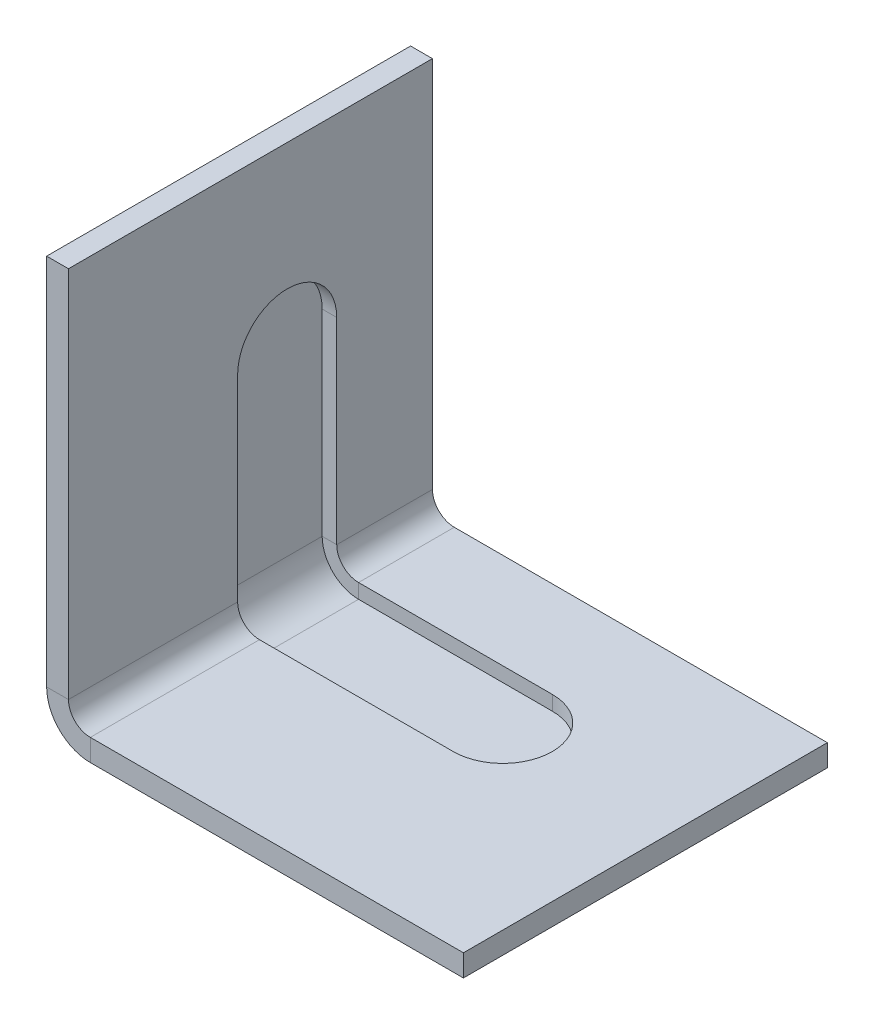
ISO-10303-21;
HEADER;
FILE_DESCRIPTION(('STEP AP214'),'2;1');
FILE_NAME('part.step','',(''),(''),'','','');
FILE_SCHEMA(('AUTOMOTIVE_DESIGN { 1 0 10303 214 1 1 1 1 }'));
ENDSEC;
DATA;
#1=APPLICATION_CONTEXT('core data for automotive mechanical design processes');
#2=APPLICATION_PROTOCOL_DEFINITION('international standard','automotive_design',2000,#1);
#3=PRODUCT_CONTEXT('',#1,'mechanical');
#4=PRODUCT('Part','Part','',(#3));
#5=PRODUCT_RELATED_PRODUCT_CATEGORY('part','',(#4));
#6=PRODUCT_DEFINITION_FORMATION('','',#4);
#7=PRODUCT_DEFINITION_CONTEXT('part definition',#1,'design');
#8=PRODUCT_DEFINITION('design','',#6,#7);
#9=PRODUCT_DEFINITION_SHAPE('','',#8);
#10=(LENGTH_UNIT() NAMED_UNIT(*) SI_UNIT(.MILLI.,.METRE.));
#11=(NAMED_UNIT(*) PLANE_ANGLE_UNIT() SI_UNIT($,.RADIAN.));
#12=(NAMED_UNIT(*) SI_UNIT($,.STERADIAN.) SOLID_ANGLE_UNIT());
#13=UNCERTAINTY_MEASURE_WITH_UNIT(LENGTH_MEASURE(1.E-05),#10,'distance_accuracy_value','');
#14=(GEOMETRIC_REPRESENTATION_CONTEXT(3) GLOBAL_UNCERTAINTY_ASSIGNED_CONTEXT((#13)) GLOBAL_UNIT_ASSIGNED_CONTEXT((#10,
#11,#12)) REPRESENTATION_CONTEXT('',''));
#15=CARTESIAN_POINT('',(0.,0.,0.));
#16=DIRECTION('',(0.,0.,1.));
#17=DIRECTION('',(1.,0.,0.));
#18=AXIS2_PLACEMENT_3D('',#15,#16,#17);
#19=CARTESIAN_POINT('',(-9.8014285714286,30.2073806679078,26.7582020038617));
#20=DIRECTION('',(0.,0.,1.));
#21=DIRECTION('',(0.,-1.,0.));
#22=AXIS2_PLACEMENT_3D('',#19,#20,#21);
#23=PLANE('',#22);
#24=DIRECTION('',(0.,-1.,0.));
#25=VECTOR('',#24,1.);
#26=CARTESIAN_POINT('',(-7.8014285714286,30.2073806679078,26.7582020038617));
#27=LINE('',#26,#25);
#28=CARTESIAN_POINT('',(-7.8014285714286,30.2073806679078,26.7582020038617));
#29=VERTEX_POINT('',#28);
#30=CARTESIAN_POINT('',(-7.8014285714286,3.17143459243136,26.7582020038617));
#31=VERTEX_POINT('',#30);
#32=EDGE_CURVE('E363',#29,#31,#27,.T.);
#33=ORIENTED_EDGE('',*,*,#32,.T.);
#34=CARTESIAN_POINT('',(-7.8014285714286,3.17143459243144,26.7582020038617));
#35=CARTESIAN_POINT('',(-9.80142857142861,3.17143459243138,26.7582020038617));
#36=B_SPLINE_CURVE_WITH_KNOTS('',1,(#34,#35),.UNSPECIFIED.,.F.,.F.,(2,2),(0.,1.),.UNSPECIFIED.);
#37=CARTESIAN_POINT('',(-9.8014285714286,3.17143459243136,26.7582020038617));
#38=VERTEX_POINT('',#37);
#39=EDGE_CURVE('E401',#31,#38,#36,.T.);
#40=ORIENTED_EDGE('',*,*,#39,.T.);
#41=DIRECTION('',(0.,-1.,0.));
#42=VECTOR('',#41,1.);
#43=CARTESIAN_POINT('',(-9.8014285714286,30.2073806679078,26.7582020038617));
#44=LINE('',#43,#42);
#45=CARTESIAN_POINT('',(-9.8014285714286,30.2073806679078,26.7582020038617));
#46=VERTEX_POINT('',#45);
#47=EDGE_CURVE('E359',#46,#38,#44,.T.);
#48=ORIENTED_EDGE('',*,*,#47,.F.);
#49=DIRECTION('',(1.,0.,0.));
#50=VECTOR('',#49,1.);
#51=CARTESIAN_POINT('',(-9.8014285714286,30.2073806679078,26.7582020038617));
#52=LINE('',#51,#50);
#53=EDGE_CURVE('E367',#46,#29,#52,.T.);
#54=ORIENTED_EDGE('',*,*,#53,.T.);
#55=EDGE_LOOP('',(#33,#40,#48,#54));
#56=FACE_BOUND('',#55,.T.);
#57=ADVANCED_FACE('F125',(#56),#23,.F.);
#58=CARTESIAN_POINT('',(-7.8014285714286,54.4285714285714,50.));
#59=DIRECTION('',(1.,0.,0.));
#60=DIRECTION('',(0.,0.,-1.));
#61=AXIS2_PLACEMENT_3D('',#58,#59,#60);
#62=PLANE('',#61);
#63=CARTESIAN_POINT('',(-7.8014285714286,30.2073806679078,19.9530054101729));
#64=DIRECTION('',(1.,0.,0.));
#65=DIRECTION('',(0.,1.,0.));
#66=AXIS2_PLACEMENT_3D('',#63,#64,#65);
#67=CIRCLE('',#66,6.80519659368883);
#68=CARTESIAN_POINT('',(-7.8014285714286,30.2073806679078,13.147808816484));
#69=VERTEX_POINT('',#68);
#70=EDGE_CURVE('E345',#69,#29,#67,.T.);
#71=ORIENTED_EDGE('',*,*,#70,.F.);
#72=DIRECTION('',(0.,-1.,0.));
#73=VECTOR('',#72,1.);
#74=CARTESIAN_POINT('',(-7.8014285714286,30.2073806679078,13.147808816484));
#75=LINE('',#74,#73);
#76=CARTESIAN_POINT('',(-7.8014285714286,3.17143459243141,13.147808816484));
#77=VERTEX_POINT('',#76);
#78=EDGE_CURVE('E360',#69,#77,#75,.T.);
#79=ORIENTED_EDGE('',*,*,#78,.T.);
#80=DIRECTION('',(0.,0.,-1.));
#81=VECTOR('',#80,1.);
#82=CARTESIAN_POINT('',(-7.8014285714286,3.17143459243136,50.));
#83=LINE('',#82,#81);
#84=CARTESIAN_POINT('',(-7.80142857142856,3.17143459243141,0.));
#85=VERTEX_POINT('',#84);
#86=EDGE_CURVE('E370',#77,#85,#83,.T.);
#87=ORIENTED_EDGE('',*,*,#86,.T.);
#88=DIRECTION('',(0.,-1.,0.));
#89=VECTOR('',#88,1.);
#90=CARTESIAN_POINT('',(-7.8014285714286,54.4285714285714,0.));
#91=LINE('',#90,#89);
#92=CARTESIAN_POINT('',(-7.8014285714286,54.4285714285714,0.));
#93=VERTEX_POINT('',#92);
#94=EDGE_CURVE('E374',#93,#85,#91,.T.);
#95=ORIENTED_EDGE('',*,*,#94,.F.);
#96=DIRECTION('',(0.,0.,-1.));
#97=VECTOR('',#96,1.);
#98=CARTESIAN_POINT('',(-7.8014285714286,54.4285714285714,50.));
#99=LINE('',#98,#97);
#100=CARTESIAN_POINT('',(-7.8014285714286,54.4285714285714,50.));
#101=VERTEX_POINT('',#100);
#102=EDGE_CURVE('E381',#101,#93,#99,.T.);
#103=ORIENTED_EDGE('',*,*,#102,.F.);
#104=DIRECTION('',(0.,-1.,0.));
#105=VECTOR('',#104,1.);
#106=CARTESIAN_POINT('',(-7.8014285714286,54.4285714285714,50.));
#107=LINE('',#106,#105);
#108=CARTESIAN_POINT('',(-7.80142857142861,3.17143459243141,50.));
#109=VERTEX_POINT('',#108);
#110=EDGE_CURVE('E379',#101,#109,#107,.T.);
#111=ORIENTED_EDGE('',*,*,#110,.T.);
#112=DIRECTION('',(0.,0.,-1.));
#113=VECTOR('',#112,1.);
#114=CARTESIAN_POINT('',(-7.8014285714286,3.17143459243136,50.));
#115=LINE('',#114,#113);
#116=EDGE_CURVE('E409',#109,#31,#115,.T.);
#117=ORIENTED_EDGE('',*,*,#116,.T.);
#118=ORIENTED_EDGE('',*,*,#32,.F.);
#119=EDGE_LOOP('',(#71,#79,#87,#95,#103,#111,#117,#118));
#120=FACE_BOUND('',#119,.T.);
#121=ADVANCED_FACE('F445',(#120),#62,.T.);
#122=CARTESIAN_POINT('',(-10.8014285714286,54.4285714285714,50.));
#123=DIRECTION('',(0.,1.,0.));
#124=DIRECTION('',(0.,0.,1.));
#125=AXIS2_PLACEMENT_3D('',#122,#123,#124);
#126=PLANE('',#125);
#127=DIRECTION('',(1.,0.,0.));
#128=VECTOR('',#127,1.);
#129=CARTESIAN_POINT('',(-10.8014285714286,54.4285714285714,0.));
#130=LINE('',#129,#128);
#131=CARTESIAN_POINT('',(-10.8014285714286,54.4285714285714,0.));
#132=VERTEX_POINT('',#131);
#133=EDGE_CURVE('E376',#132,#93,#130,.T.);
#134=ORIENTED_EDGE('',*,*,#133,.F.);
#135=DIRECTION('',(0.,0.,-1.));
#136=VECTOR('',#135,1.);
#137=CARTESIAN_POINT('',(-10.8014285714286,54.4285714285714,50.));
#138=LINE('',#137,#136);
#139=CARTESIAN_POINT('',(-10.8014285714286,54.4285714285714,50.));
#140=VERTEX_POINT('',#139);
#141=EDGE_CURVE('E372',#140,#132,#138,.T.);
#142=ORIENTED_EDGE('',*,*,#141,.F.);
#143=DIRECTION('',(1.,0.,0.));
#144=VECTOR('',#143,1.);
#145=CARTESIAN_POINT('',(-10.8014285714286,54.4285714285714,50.));
#146=LINE('',#145,#144);
#147=EDGE_CURVE('E366',#140,#101,#146,.T.);
#148=ORIENTED_EDGE('',*,*,#147,.T.);
#149=ORIENTED_EDGE('',*,*,#102,.T.);
#150=EDGE_LOOP('',(#134,#142,#148,#149));
#151=FACE_BOUND('',#150,.T.);
#152=ADVANCED_FACE('F487',(#151),#126,.T.);
#153=CARTESIAN_POINT('',(0.,0.,0.));
#154=DIRECTION('',(0.,0.,1.));
#155=DIRECTION('',(1.,0.,0.));
#156=AXIS2_PLACEMENT_3D('',#153,#154,#155);
#157=PLANE('',#156);
#158=DIRECTION('',(1.,0.,0.));
#159=VECTOR('',#158,1.);
#160=CARTESIAN_POINT('',(0.,3.17143459243136,0.));
#161=LINE('',#160,#159);
#162=CARTESIAN_POINT('',(-10.8014285714286,3.17143459243141,0.));
#163=VERTEX_POINT('',#162);
#164=EDGE_CURVE('E13',#163,#85,#161,.T.);
#165=ORIENTED_EDGE('',*,*,#164,.F.);
#166=DIRECTION('',(0.,1.,0.));
#167=VECTOR('',#166,1.);
#168=CARTESIAN_POINT('',(-10.8014285714286,54.4285714285714,0.));
#169=LINE('',#168,#167);
#170=EDGE_CURVE('E141',#132,#163,#169,.F.);
#171=ORIENTED_EDGE('',*,*,#170,.F.);
#172=ORIENTED_EDGE('',*,*,#133,.T.);
#173=ORIENTED_EDGE('',*,*,#94,.T.);
#174=EDGE_LOOP('',(#165,#171,#172,#173));
#175=FACE_BOUND('',#174,.T.);
#176=ADVANCED_FACE('F450',(#175),#157,.F.);
#177=CARTESIAN_POINT('',(-10.8014285714286,54.4285714285714,50.));
#178=DIRECTION('',(1.,0.,0.));
#179=DIRECTION('',(0.,0.,-1.));
#180=AXIS2_PLACEMENT_3D('',#177,#178,#179);
#181=PLANE('',#180);
#182=DIRECTION('',(0.,0.,-1.));
#183=VECTOR('',#182,1.);
#184=CARTESIAN_POINT('',(-10.8014285714286,3.17143459243136,50.));
#185=LINE('',#184,#183);
#186=CARTESIAN_POINT('',(-10.8014285714286,3.17143459243141,50.));
#187=VERTEX_POINT('',#186);
#188=EDGE_CURVE('E133',#187,#163,#185,.T.);
#189=ORIENTED_EDGE('',*,*,#188,.F.);
#190=DIRECTION('',(0.,1.,0.));
#191=VECTOR('',#190,1.);
#192=CARTESIAN_POINT('',(-10.8014285714286,54.4285714285714,50.));
#193=LINE('',#192,#191);
#194=EDGE_CURVE('E149',#140,#187,#193,.F.);
#195=ORIENTED_EDGE('',*,*,#194,.F.);
#196=ORIENTED_EDGE('',*,*,#141,.T.);
#197=ORIENTED_EDGE('',*,*,#170,.T.);
#198=EDGE_LOOP('',(#189,#195,#196,#197));
#199=FACE_BOUND('',#198,.T.);
#200=ADVANCED_FACE('F456',(#199),#181,.F.);
#201=CARTESIAN_POINT('',(0.,0.,50.));
#202=DIRECTION('',(0.,0.,1.));
#203=DIRECTION('',(1.,0.,0.));
#204=AXIS2_PLACEMENT_3D('',#201,#202,#203);
#205=PLANE('',#204);
#206=ORIENTED_EDGE('',*,*,#194,.T.);
#207=DIRECTION('',(1.,0.,0.));
#208=VECTOR('',#207,1.);
#209=CARTESIAN_POINT('',(0.,3.17143459243136,50.));
#210=LINE('',#209,#208);
#211=EDGE_CURVE('E415',#187,#109,#210,.T.);
#212=ORIENTED_EDGE('',*,*,#211,.T.);
#213=ORIENTED_EDGE('',*,*,#110,.F.);
#214=ORIENTED_EDGE('',*,*,#147,.F.);
#215=EDGE_LOOP('',(#206,#212,#213,#214));
#216=FACE_BOUND('',#215,.T.);
#217=ADVANCED_FACE('F462',(#216),#205,.T.);
#218=CARTESIAN_POINT('',(-9.8014285714286,30.2073806679078,19.9530054101729));
#219=DIRECTION('',(1.,0.,0.));
#220=DIRECTION('',(0.,1.,0.));
#221=AXIS2_PLACEMENT_3D('',#218,#219,#220);
#222=CYLINDRICAL_SURFACE('',#221,6.80519659368883);
#223=ORIENTED_EDGE('',*,*,#70,.T.);
#224=ORIENTED_EDGE('',*,*,#53,.F.);
#225=CARTESIAN_POINT('',(-9.8014285714286,30.2073806679078,19.9530054101729));
#226=DIRECTION('',(1.,0.,0.));
#227=DIRECTION('',(0.,1.,0.));
#228=AXIS2_PLACEMENT_3D('',#225,#226,#227);
#229=CIRCLE('',#228,6.80519659368883);
#230=CARTESIAN_POINT('',(-9.8014285714286,30.2073806679078,13.147808816484));
#231=VERTEX_POINT('',#230);
#232=EDGE_CURVE('E356',#231,#46,#229,.T.);
#233=ORIENTED_EDGE('',*,*,#232,.F.);
#234=DIRECTION('',(1.,0.,0.));
#235=VECTOR('',#234,1.);
#236=CARTESIAN_POINT('',(-9.8014285714286,30.2073806679078,13.147808816484));
#237=LINE('',#236,#235);
#238=EDGE_CURVE('E364',#231,#69,#237,.T.);
#239=ORIENTED_EDGE('',*,*,#238,.T.);
#240=EDGE_LOOP('',(#223,#224,#233,#239));
#241=FACE_BOUND('',#240,.T.);
#242=ADVANCED_FACE('F472',(#241),#222,.F.);
#243=CARTESIAN_POINT('',(-9.8014285714286,30.2073806679078,13.147808816484));
#244=DIRECTION('',(0.,0.,1.));
#245=DIRECTION('',(0.,-1.,0.));
#246=AXIS2_PLACEMENT_3D('',#243,#244,#245);
#247=PLANE('',#246);
#248=CARTESIAN_POINT('',(-7.8014285714286,3.17143459243141,13.147808816484));
#249=CARTESIAN_POINT('',(-9.8014285714286,3.17143459243134,13.147808816484));
#250=B_SPLINE_CURVE_WITH_KNOTS('',1,(#248,#249),.UNSPECIFIED.,.F.,.F.,(2,2),(0.,1.),.UNSPECIFIED.);
#251=CARTESIAN_POINT('',(-9.8014285714286,3.17143459243138,13.147808816484));
#252=VERTEX_POINT('',#251);
#253=EDGE_CURVE('E387',#77,#252,#250,.T.);
#254=ORIENTED_EDGE('',*,*,#253,.F.);
#255=ORIENTED_EDGE('',*,*,#78,.F.);
#256=ORIENTED_EDGE('',*,*,#238,.F.);
#257=DIRECTION('',(0.,-1.,0.));
#258=VECTOR('',#257,1.);
#259=CARTESIAN_POINT('',(-9.8014285714286,30.2073806679078,13.147808816484));
#260=LINE('',#259,#258);
#261=EDGE_CURVE('E128',#231,#252,#260,.T.);
#262=ORIENTED_EDGE('',*,*,#261,.T.);
#263=EDGE_LOOP('',(#254,#255,#256,#262));
#264=FACE_BOUND('',#263,.T.);
#265=ADVANCED_FACE('F426',(#264),#247,.T.);
#266=CARTESIAN_POINT('',(-9.8014285714286,30.2073806679078,19.9530054101729));
#267=DIRECTION('',(1.,0.,0.));
#268=DIRECTION('',(0.,1.,0.));
#269=AXIS2_PLACEMENT_3D('',#266,#267,#268);
#270=PLANE('',#269);
#271=CARTESIAN_POINT('',(-9.8014285714286,3.17143459243134,13.147808816484));
#272=CARTESIAN_POINT('',(-9.8014285714286,3.17143459243138,26.7582020038617));
#273=B_SPLINE_CURVE_WITH_KNOTS('',1,(#271,#272),.UNSPECIFIED.,.F.,.F.,(2,2),(0.,1.),.UNSPECIFIED.);
#274=EDGE_CURVE('E392',#252,#38,#273,.T.);
#275=ORIENTED_EDGE('',*,*,#274,.F.);
#276=ORIENTED_EDGE('',*,*,#261,.F.);
#277=ORIENTED_EDGE('',*,*,#232,.T.);
#278=ORIENTED_EDGE('',*,*,#47,.T.);
#279=EDGE_LOOP('',(#275,#276,#277,#278));
#280=FACE_BOUND('',#279,.T.);
#281=ADVANCED_FACE('F431',(#280),#270,.T.);
#282=CARTESIAN_POINT('',(-4.80142857142856,3.17143459243142,-44.0123078662554));
#283=DIRECTION('',(0.,0.,1.));
#284=DIRECTION('',(1.,0.,0.));
#285=AXIS2_PLACEMENT_3D('',#282,#283,#284);
#286=CYLINDRICAL_SURFACE('',#285,5.00000000000001);
#287=CARTESIAN_POINT('',(-4.80142857142854,-1.82856540756859,13.147808816484));
#288=CARTESIAN_POINT('',(-4.80142857142854,-1.82856540756859,26.7582020038617));
#289=B_SPLINE_CURVE_WITH_KNOTS('',1,(#287,#288),.UNSPECIFIED.,.F.,.F.,(2,2),(0.,1.),.UNSPECIFIED.);
#290=CARTESIAN_POINT('',(-4.80142857142854,-1.82856540756859,13.147808816484));
#291=VERTEX_POINT('',#290);
#292=CARTESIAN_POINT('',(-4.80142857142856,-1.82856540756859,26.7582020038617));
#293=VERTEX_POINT('',#292);
#294=EDGE_CURVE('E288',#291,#293,#289,.T.);
#295=ORIENTED_EDGE('',*,*,#294,.F.);
#296=CARTESIAN_POINT('',(-4.80142857142856,3.17143459243142,13.147808816484));
#297=DIRECTION('',(0.,0.,1.));
#298=DIRECTION('',(1.,0.,0.));
#299=AXIS2_PLACEMENT_3D('',#296,#297,#298);
#300=CIRCLE('',#299,5.00000000000001);
#301=EDGE_CURVE('E347',#252,#291,#300,.T.);
#302=ORIENTED_EDGE('',*,*,#301,.F.);
#303=ORIENTED_EDGE('',*,*,#274,.T.);
#304=CARTESIAN_POINT('',(-4.80142857142857,3.17143459243142,26.7582020038617));
#305=DIRECTION('',(0.,0.,1.));
#306=DIRECTION('',(1.,0.,0.));
#307=AXIS2_PLACEMENT_3D('',#304,#305,#306);
#308=CIRCLE('',#307,5.);
#309=EDGE_CURVE('E268',#38,#293,#308,.T.);
#310=ORIENTED_EDGE('',*,*,#309,.T.);
#311=EDGE_LOOP('',(#295,#302,#303,#310));
#312=FACE_BOUND('',#311,.T.);
#313=ADVANCED_FACE('F434',(#312),#286,.F.);
#314=CARTESIAN_POINT('',(-4.80142857142857,3.17143459243142,26.7582020038617));
#315=DIRECTION('',(0.,0.,1.));
#316=DIRECTION('',(1.,0.,0.));
#317=AXIS2_PLACEMENT_3D('',#314,#315,#316);
#318=PLANE('',#317);
#319=ORIENTED_EDGE('',*,*,#309,.F.);
#320=ORIENTED_EDGE('',*,*,#39,.F.);
#321=CARTESIAN_POINT('',(-4.80142857142857,3.17143459243142,26.7582020038617));
#322=DIRECTION('',(0.,0.,1.));
#323=DIRECTION('',(1.,0.,0.));
#324=AXIS2_PLACEMENT_3D('',#321,#322,#323);
#325=CIRCLE('',#324,2.99999999999999);
#326=CARTESIAN_POINT('',(-4.80142857142856,0.171434592431424,26.7582020038617));
#327=VERTEX_POINT('',#326);
#328=EDGE_CURVE('E270',#31,#327,#325,.T.);
#329=ORIENTED_EDGE('',*,*,#328,.T.);
#330=CARTESIAN_POINT('',(-4.80142857142856,0.171434592431411,26.7582020038617));
#331=CARTESIAN_POINT('',(-4.80142857142854,-1.82856540756859,26.7582020038617));
#332=B_SPLINE_CURVE_WITH_KNOTS('',1,(#330,#331),.UNSPECIFIED.,.F.,.F.,(2,2),(0.,1.),.UNSPECIFIED.);
#333=EDGE_CURVE('E321',#327,#293,#332,.T.);
#334=ORIENTED_EDGE('',*,*,#333,.T.);
#335=EDGE_LOOP('',(#319,#320,#329,#334));
#336=FACE_BOUND('',#335,.T.);
#337=ADVANCED_FACE('F469',(#336),#318,.F.);
#338=CARTESIAN_POINT('',(-4.80142857142856,3.17143459243142,-44.0123078662554));
#339=DIRECTION('',(0.,0.,1.));
#340=DIRECTION('',(1.,0.,0.));
#341=AXIS2_PLACEMENT_3D('',#338,#339,#340);
#342=CYLINDRICAL_SURFACE('',#341,3.);
#343=CARTESIAN_POINT('',(-4.80142857142857,3.17143459243142,50.));
#344=DIRECTION('',(0.,0.,1.));
#345=DIRECTION('',(1.,0.,0.));
#346=AXIS2_PLACEMENT_3D('',#343,#344,#345);
#347=CIRCLE('',#346,2.99999999999999);
#348=CARTESIAN_POINT('',(-4.80142857142856,0.171434592431422,50.));
#349=VERTEX_POINT('',#348);
#350=EDGE_CURVE('E353',#109,#349,#347,.T.);
#351=ORIENTED_EDGE('',*,*,#350,.T.);
#352=DIRECTION('',(0.,0.,-1.));
#353=VECTOR('',#352,1.);
#354=CARTESIAN_POINT('',(-4.80142857142854,0.171434592431421,50.));
#355=LINE('',#354,#353);
#356=EDGE_CURVE('E326',#349,#327,#355,.T.);
#357=ORIENTED_EDGE('',*,*,#356,.T.);
#358=ORIENTED_EDGE('',*,*,#328,.F.);
#359=ORIENTED_EDGE('',*,*,#116,.F.);
#360=EDGE_LOOP('',(#351,#357,#358,#359));
#361=FACE_BOUND('',#360,.T.);
#362=ADVANCED_FACE('F465',(#361),#342,.F.);
#363=CARTESIAN_POINT('',(-4.80142857142857,3.17143459243142,50.));
#364=DIRECTION('',(0.,0.,1.));
#365=DIRECTION('',(1.,0.,0.));
#366=AXIS2_PLACEMENT_3D('',#363,#364,#365);
#367=PLANE('',#366);
#368=ORIENTED_EDGE('',*,*,#211,.F.);
#369=CARTESIAN_POINT('',(-4.80142857142856,3.17143459243142,50.));
#370=DIRECTION('',(0.,0.,-1.));
#371=DIRECTION('',(1.,0.,0.));
#372=AXIS2_PLACEMENT_3D('',#369,#370,#371);
#373=CIRCLE('',#372,6.);
#374=CARTESIAN_POINT('',(-4.80142857142853,-2.82856540756858,50.));
#375=VERTEX_POINT('',#374);
#376=EDGE_CURVE('E350',#375,#187,#373,.T.);
#377=ORIENTED_EDGE('',*,*,#376,.F.);
#378=DIRECTION('',(0.,1.,0.));
#379=VECTOR('',#378,1.);
#380=CARTESIAN_POINT('',(-4.80142857142857,7.97286316385999,50.));
#381=LINE('',#380,#379);
#382=EDGE_CURVE('E332',#375,#349,#381,.T.);
#383=ORIENTED_EDGE('',*,*,#382,.T.);
#384=ORIENTED_EDGE('',*,*,#350,.F.);
#385=EDGE_LOOP('',(#368,#377,#383,#384));
#386=FACE_BOUND('',#385,.T.);
#387=ADVANCED_FACE('F459',(#386),#367,.T.);
#388=CARTESIAN_POINT('',(-4.80142857142856,3.17143459243142,-44.0123078662554));
#389=DIRECTION('',(0.,0.,1.));
#390=DIRECTION('',(1.,0.,0.));
#391=AXIS2_PLACEMENT_3D('',#388,#389,#390);
#392=CYLINDRICAL_SURFACE('',#391,6.);
#393=ORIENTED_EDGE('',*,*,#376,.T.);
#394=ORIENTED_EDGE('',*,*,#188,.T.);
#395=CARTESIAN_POINT('',(-4.80142857142856,3.17143459243142,0.));
#396=DIRECTION('',(0.,0.,1.));
#397=DIRECTION('',(-1.,0.,0.));
#398=AXIS2_PLACEMENT_3D('',#395,#396,#397);
#399=CIRCLE('',#398,6.);
#400=CARTESIAN_POINT('',(-4.80142857142853,-2.82856540756858,0.));
#401=VERTEX_POINT('',#400);
#402=EDGE_CURVE('E342',#163,#401,#399,.T.);
#403=ORIENTED_EDGE('',*,*,#402,.T.);
#404=DIRECTION('',(0.,0.,-1.));
#405=VECTOR('',#404,1.);
#406=CARTESIAN_POINT('',(-4.80142857142853,-2.82856540756858,50.));
#407=LINE('',#406,#405);
#408=EDGE_CURVE('E276',#375,#401,#407,.T.);
#409=ORIENTED_EDGE('',*,*,#408,.F.);
#410=EDGE_LOOP('',(#393,#394,#403,#409));
#411=FACE_BOUND('',#410,.T.);
#412=ADVANCED_FACE('F453',(#411),#392,.T.);
#413=CARTESIAN_POINT('',(-4.80142857142856,3.17143459243142,13.147808816484));
#414=DIRECTION('',(0.,0.,1.));
#415=DIRECTION('',(1.,0.,0.));
#416=AXIS2_PLACEMENT_3D('',#413,#414,#415);
#417=PLANE('',#416);
#418=CARTESIAN_POINT('',(-4.80142857142856,0.171434592431411,13.147808816484));
#419=CARTESIAN_POINT('',(-4.80142857142854,-1.82856540756859,13.147808816484));
#420=B_SPLINE_CURVE_WITH_KNOTS('',1,(#418,#419),.UNSPECIFIED.,.F.,.F.,(2,2),(0.,1.),.UNSPECIFIED.);
#421=CARTESIAN_POINT('',(-4.80142857142856,0.171434592431429,13.147808816484));
#422=VERTEX_POINT('',#421);
#423=EDGE_CURVE('E262',#422,#291,#420,.T.);
#424=ORIENTED_EDGE('',*,*,#423,.F.);
#425=CARTESIAN_POINT('',(-4.80142857142857,3.17143459243142,13.147808816484));
#426=DIRECTION('',(0.,0.,1.));
#427=DIRECTION('',(1.,0.,0.));
#428=AXIS2_PLACEMENT_3D('',#425,#426,#427);
#429=CIRCLE('',#428,2.99999999999999);
#430=EDGE_CURVE('E338',#77,#422,#429,.T.);
#431=ORIENTED_EDGE('',*,*,#430,.F.);
#432=ORIENTED_EDGE('',*,*,#253,.T.);
#433=ORIENTED_EDGE('',*,*,#301,.T.);
#434=EDGE_LOOP('',(#424,#431,#432,#433));
#435=FACE_BOUND('',#434,.T.);
#436=ADVANCED_FACE('F437',(#435),#417,.T.);
#437=CARTESIAN_POINT('',(-4.80142857142856,3.17143459243142,0.));
#438=DIRECTION('',(0.,0.,1.));
#439=DIRECTION('',(1.,0.,0.));
#440=AXIS2_PLACEMENT_3D('',#437,#438,#439);
#441=PLANE('',#440);
#442=ORIENTED_EDGE('',*,*,#164,.T.);
#443=CARTESIAN_POINT('',(-4.80142857142857,3.17143459243142,0.));
#444=DIRECTION('',(0.,0.,-1.));
#445=DIRECTION('',(-1.,0.,0.));
#446=AXIS2_PLACEMENT_3D('',#443,#444,#445);
#447=CIRCLE('',#446,2.99999999999999);
#448=CARTESIAN_POINT('',(-4.80142857142856,0.171434592431423,0.));
#449=VERTEX_POINT('',#448);
#450=EDGE_CURVE('E341',#449,#85,#447,.T.);
#451=ORIENTED_EDGE('',*,*,#450,.F.);
#452=DIRECTION('',(0.,1.,0.));
#453=VECTOR('',#452,1.);
#454=CARTESIAN_POINT('',(-4.80142857142857,7.97286316385999,0.));
#455=LINE('',#454,#453);
#456=EDGE_CURVE('E249',#401,#449,#455,.T.);
#457=ORIENTED_EDGE('',*,*,#456,.F.);
#458=ORIENTED_EDGE('',*,*,#402,.F.);
#459=EDGE_LOOP('',(#442,#451,#457,#458));
#460=FACE_BOUND('',#459,.T.);
#461=ADVANCED_FACE('F448',(#460),#441,.F.);
#462=CARTESIAN_POINT('',(-4.80142857142856,3.17143459243142,-44.0123078662554));
#463=DIRECTION('',(0.,0.,1.));
#464=DIRECTION('',(1.,0.,0.));
#465=AXIS2_PLACEMENT_3D('',#462,#463,#464);
#466=CYLINDRICAL_SURFACE('',#465,3.);
#467=DIRECTION('',(0.,0.,-1.));
#468=VECTOR('',#467,1.);
#469=CARTESIAN_POINT('',(-4.80142857142854,0.171434592431421,50.));
#470=LINE('',#469,#468);
#471=EDGE_CURVE('E335',#422,#449,#470,.T.);
#472=ORIENTED_EDGE('',*,*,#471,.T.);
#473=ORIENTED_EDGE('',*,*,#450,.T.);
#474=ORIENTED_EDGE('',*,*,#86,.F.);
#475=ORIENTED_EDGE('',*,*,#430,.T.);
#476=EDGE_LOOP('',(#472,#473,#474,#475));
#477=FACE_BOUND('',#476,.T.);
#478=ADVANCED_FACE('F441',(#477),#466,.F.);
#479=CARTESIAN_POINT('',(46.4557082647115,0.1714345924316,50.));
#480=DIRECTION('',(1.,0.,0.));
#481=DIRECTION('',(0.,0.,-1.));
#482=AXIS2_PLACEMENT_3D('',#479,#480,#481);
#483=PLANE('',#482);
#484=DIRECTION('',(0.,-1.,0.));
#485=VECTOR('',#484,1.);
#486=CARTESIAN_POINT('',(46.4557082647115,0.1714345924316,0.));
#487=LINE('',#486,#485);
#488=CARTESIAN_POINT('',(46.4557082647115,0.1714345924316,0.));
#489=VERTEX_POINT('',#488);
#490=CARTESIAN_POINT('',(46.4557082647115,-2.8285654075684,0.));
#491=VERTEX_POINT('',#490);
#492=EDGE_CURVE('E247',#489,#491,#487,.T.);
#493=ORIENTED_EDGE('',*,*,#492,.F.);
#494=DIRECTION('',(0.,0.,-1.));
#495=VECTOR('',#494,1.);
#496=CARTESIAN_POINT('',(46.4557082647115,0.1714345924316,50.));
#497=LINE('',#496,#495);
#498=CARTESIAN_POINT('',(46.4557082647115,0.1714345924316,50.));
#499=VERTEX_POINT('',#498);
#500=EDGE_CURVE('E254',#499,#489,#497,.T.);
#501=ORIENTED_EDGE('',*,*,#500,.F.);
#502=DIRECTION('',(0.,-1.,0.));
#503=VECTOR('',#502,1.);
#504=CARTESIAN_POINT('',(46.4557082647115,0.1714345924316,50.));
#505=LINE('',#504,#503);
#506=CARTESIAN_POINT('',(46.4557082647115,-2.8285654075684,50.));
#507=VERTEX_POINT('',#506);
#508=EDGE_CURVE('E319',#499,#507,#505,.T.);
#509=ORIENTED_EDGE('',*,*,#508,.T.);
#510=DIRECTION('',(0.,0.,-1.));
#511=VECTOR('',#510,1.);
#512=CARTESIAN_POINT('',(46.4557082647115,-2.8285654075684,50.));
#513=LINE('',#512,#511);
#514=EDGE_CURVE('E267',#507,#491,#513,.T.);
#515=ORIENTED_EDGE('',*,*,#514,.T.);
#516=EDGE_LOOP('',(#493,#501,#509,#515));
#517=FACE_BOUND('',#516,.T.);
#518=ADVANCED_FACE('F265',(#517),#483,.T.);
#519=CARTESIAN_POINT('',(21.8153830734877,-1.8285654075685,19.9530054101729));
#520=DIRECTION('',(0.,1.,0.));
#521=DIRECTION('',(-1.,0.,0.));
#522=AXIS2_PLACEMENT_3D('',#519,#520,#521);
#523=CYLINDRICAL_SURFACE('',#522,6.80519659368883);
#524=CARTESIAN_POINT('',(21.8153830734877,0.171434592431504,19.9530054101729));
#525=DIRECTION('',(0.,1.,0.));
#526=DIRECTION('',(-1.,0.,0.));
#527=AXIS2_PLACEMENT_3D('',#524,#525,#526);
#528=CIRCLE('',#527,6.80519659368883);
#529=CARTESIAN_POINT('',(21.8153830734877,0.171434592431504,26.7582020038617));
#530=VERTEX_POINT('',#529);
#531=CARTESIAN_POINT('',(21.8153830734877,0.171434592431504,13.147808816484));
#532=VERTEX_POINT('',#531);
#533=EDGE_CURVE('E315',#530,#532,#528,.T.);
#534=ORIENTED_EDGE('',*,*,#533,.T.);
#535=DIRECTION('',(0.,1.,0.));
#536=VECTOR('',#535,1.);
#537=CARTESIAN_POINT('',(21.8153830734877,-1.8285654075685,13.147808816484));
#538=LINE('',#537,#536);
#539=CARTESIAN_POINT('',(21.8153830734877,-1.8285654075685,13.147808816484));
#540=VERTEX_POINT('',#539);
#541=EDGE_CURVE('E294',#540,#532,#538,.T.);
#542=ORIENTED_EDGE('',*,*,#541,.F.);
#543=CARTESIAN_POINT('',(21.8153830734877,-1.8285654075685,19.9530054101729));
#544=DIRECTION('',(0.,1.,0.));
#545=DIRECTION('',(-1.,0.,0.));
#546=AXIS2_PLACEMENT_3D('',#543,#544,#545);
#547=CIRCLE('',#546,6.80519659368883);
#548=CARTESIAN_POINT('',(21.8153830734877,-1.8285654075685,26.7582020038617));
#549=VERTEX_POINT('',#548);
#550=EDGE_CURVE('E283',#549,#540,#547,.T.);
#551=ORIENTED_EDGE('',*,*,#550,.F.);
#552=DIRECTION('',(0.,1.,0.));
#553=VECTOR('',#552,1.);
#554=CARTESIAN_POINT('',(21.8153830734877,-1.8285654075685,26.7582020038617));
#555=LINE('',#554,#553);
#556=EDGE_CURVE('E312',#549,#530,#555,.T.);
#557=ORIENTED_EDGE('',*,*,#556,.T.);
#558=EDGE_LOOP('',(#534,#542,#551,#557));
#559=FACE_BOUND('',#558,.T.);
#560=ADVANCED_FACE('F507',(#559),#523,.F.);
#561=CARTESIAN_POINT('',(-63.1271488781456,0.171434592431218,50.));
#562=DIRECTION('',(0.,1.,0.));
#563=DIRECTION('',(0.,0.,-1.));
#564=AXIS2_PLACEMENT_3D('',#561,#562,#563);
#565=PLANE('',#564);
#566=ORIENTED_EDGE('',*,*,#471,.F.);
#567=DIRECTION('',(1.,0.,0.));
#568=VECTOR('',#567,1.);
#569=CARTESIAN_POINT('',(-38.905958117482,0.171434592431292,13.147808816484));
#570=LINE('',#569,#568);
#571=EDGE_CURVE('E309',#422,#532,#570,.T.);
#572=ORIENTED_EDGE('',*,*,#571,.T.);
#573=ORIENTED_EDGE('',*,*,#533,.F.);
#574=DIRECTION('',(1.,0.,0.));
#575=VECTOR('',#574,1.);
#576=CARTESIAN_POINT('',(-38.905958117482,0.171434592431292,26.7582020038617));
#577=LINE('',#576,#575);
#578=EDGE_CURVE('E281',#327,#530,#577,.T.);
#579=ORIENTED_EDGE('',*,*,#578,.F.);
#580=ORIENTED_EDGE('',*,*,#356,.F.);
#581=DIRECTION('',(1.,0.,0.));
#582=VECTOR('',#581,1.);
#583=CARTESIAN_POINT('',(-63.1271488781456,0.171434592431218,50.));
#584=LINE('',#583,#582);
#585=EDGE_CURVE('E258',#349,#499,#584,.T.);
#586=ORIENTED_EDGE('',*,*,#585,.T.);
#587=ORIENTED_EDGE('',*,*,#500,.T.);
#588=DIRECTION('',(1.,0.,0.));
#589=VECTOR('',#588,1.);
#590=CARTESIAN_POINT('',(-63.1271488781456,0.171434592431218,0.));
#591=LINE('',#590,#589);
#592=EDGE_CURVE('E242',#449,#489,#591,.T.);
#593=ORIENTED_EDGE('',*,*,#592,.F.);
#594=EDGE_LOOP('',(#566,#572,#573,#579,#580,#586,#587,#593));
#595=FACE_BOUND('',#594,.T.);
#596=ADVANCED_FACE('F255',(#595),#565,.T.);
#597=CARTESIAN_POINT('',(-38.905958117482,-1.82856540756871,13.147808816484));
#598=DIRECTION('',(0.,0.,1.));
#599=DIRECTION('',(1.,0.,0.));
#600=AXIS2_PLACEMENT_3D('',#597,#598,#599);
#601=PLANE('',#600);
#602=ORIENTED_EDGE('',*,*,#571,.F.);
#603=ORIENTED_EDGE('',*,*,#423,.T.);
#604=DIRECTION('',(1.,0.,0.));
#605=VECTOR('',#604,1.);
#606=CARTESIAN_POINT('',(-38.905958117482,-1.82856540756871,13.147808816484));
#607=LINE('',#606,#605);
#608=EDGE_CURVE('E299',#291,#540,#607,.T.);
#609=ORIENTED_EDGE('',*,*,#608,.T.);
#610=ORIENTED_EDGE('',*,*,#541,.T.);
#611=EDGE_LOOP('',(#602,#603,#609,#610));
#612=FACE_BOUND('',#611,.T.);
#613=ADVANCED_FACE('F579',(#612),#601,.T.);
#614=CARTESIAN_POINT('',(-38.905958117482,-1.82856540756871,19.9530054101729));
#615=DIRECTION('',(0.,1.,0.));
#616=DIRECTION('',(-1.,0.,0.));
#617=AXIS2_PLACEMENT_3D('',#614,#615,#616);
#618=PLANE('',#617);
#619=ORIENTED_EDGE('',*,*,#608,.F.);
#620=ORIENTED_EDGE('',*,*,#294,.T.);
#621=DIRECTION('',(1.,0.,0.));
#622=VECTOR('',#621,1.);
#623=CARTESIAN_POINT('',(-38.905958117482,-1.82856540756871,26.7582020038617));
#624=LINE('',#623,#622);
#625=EDGE_CURVE('E286',#293,#549,#624,.T.);
#626=ORIENTED_EDGE('',*,*,#625,.T.);
#627=ORIENTED_EDGE('',*,*,#550,.T.);
#628=EDGE_LOOP('',(#619,#620,#626,#627));
#629=FACE_BOUND('',#628,.T.);
#630=ADVANCED_FACE('F587',(#629),#618,.T.);
#631=CARTESIAN_POINT('',(-38.905958117482,-1.82856540756871,26.7582020038617));
#632=DIRECTION('',(0.,0.,1.));
#633=DIRECTION('',(1.,0.,0.));
#634=AXIS2_PLACEMENT_3D('',#631,#632,#633);
#635=PLANE('',#634);
#636=ORIENTED_EDGE('',*,*,#333,.F.);
#637=ORIENTED_EDGE('',*,*,#578,.T.);
#638=ORIENTED_EDGE('',*,*,#556,.F.);
#639=ORIENTED_EDGE('',*,*,#625,.F.);
#640=EDGE_LOOP('',(#636,#637,#638,#639));
#641=FACE_BOUND('',#640,.T.);
#642=ADVANCED_FACE('F597',(#641),#635,.F.);
#643=CARTESIAN_POINT('',(-8.69857744957421,7.97286316385998,50.));
#644=DIRECTION('',(0.,0.,1.));
#645=DIRECTION('',(0.,1.,0.));
#646=AXIS2_PLACEMENT_3D('',#643,#644,#645);
#647=PLANE('',#646);
#648=ORIENTED_EDGE('',*,*,#382,.F.);
#649=DIRECTION('',(-1.,0.,0.));
#650=VECTOR('',#649,1.);
#651=CARTESIAN_POINT('',(-63.1271488781456,-2.82856540756878,50.));
#652=LINE('',#651,#650);
#653=EDGE_CURVE('E279',#375,#507,#652,.F.);
#654=ORIENTED_EDGE('',*,*,#653,.T.);
#655=ORIENTED_EDGE('',*,*,#508,.F.);
#656=ORIENTED_EDGE('',*,*,#585,.F.);
#657=EDGE_LOOP('',(#648,#654,#655,#656));
#658=FACE_BOUND('',#657,.T.);
#659=ADVANCED_FACE('F608',(#658),#647,.T.);
#660=CARTESIAN_POINT('',(-63.1271488781456,-2.82856540756878,50.));
#661=DIRECTION('',(0.,1.,0.));
#662=DIRECTION('',(0.,0.,-1.));
#663=AXIS2_PLACEMENT_3D('',#660,#661,#662);
#664=PLANE('',#663);
#665=ORIENTED_EDGE('',*,*,#653,.F.);
#666=ORIENTED_EDGE('',*,*,#408,.T.);
#667=DIRECTION('',(-1.,0.,0.));
#668=VECTOR('',#667,1.);
#669=CARTESIAN_POINT('',(-63.1271488781456,-2.82856540756878,0.));
#670=LINE('',#669,#668);
#671=EDGE_CURVE('E274',#401,#491,#670,.F.);
#672=ORIENTED_EDGE('',*,*,#671,.T.);
#673=ORIENTED_EDGE('',*,*,#514,.F.);
#674=EDGE_LOOP('',(#665,#666,#672,#673));
#675=FACE_BOUND('',#674,.T.);
#676=ADVANCED_FACE('F618',(#675),#664,.F.);
#677=CARTESIAN_POINT('',(-8.69857744957421,7.97286316385998,0.));
#678=DIRECTION('',(0.,0.,1.));
#679=DIRECTION('',(0.,1.,0.));
#680=AXIS2_PLACEMENT_3D('',#677,#678,#679);
#681=PLANE('',#680);
#682=ORIENTED_EDGE('',*,*,#671,.F.);
#683=ORIENTED_EDGE('',*,*,#456,.T.);
#684=ORIENTED_EDGE('',*,*,#592,.T.);
#685=ORIENTED_EDGE('',*,*,#492,.T.);
#686=EDGE_LOOP('',(#682,#683,#684,#685));
#687=FACE_BOUND('',#686,.T.);
#688=ADVANCED_FACE('F245',(#687),#681,.F.);
#689=CLOSED_SHELL('',(#57,#121,#152,#176,#200,#217,#242,#265,#281,#313,#337,#362,#387,#412,#436,
#461,#478,#518,#560,#596,#613,#630,#642,#659,#676,#688));
#690=MANIFOLD_SOLID_BREP('B2',#689);
#691=ADVANCED_BREP_SHAPE_REPRESENTATION('',(#18,#690),#14);
#692=SHAPE_DEFINITION_REPRESENTATION(#9,#691);
ENDSEC;
END-ISO-10303-21;
